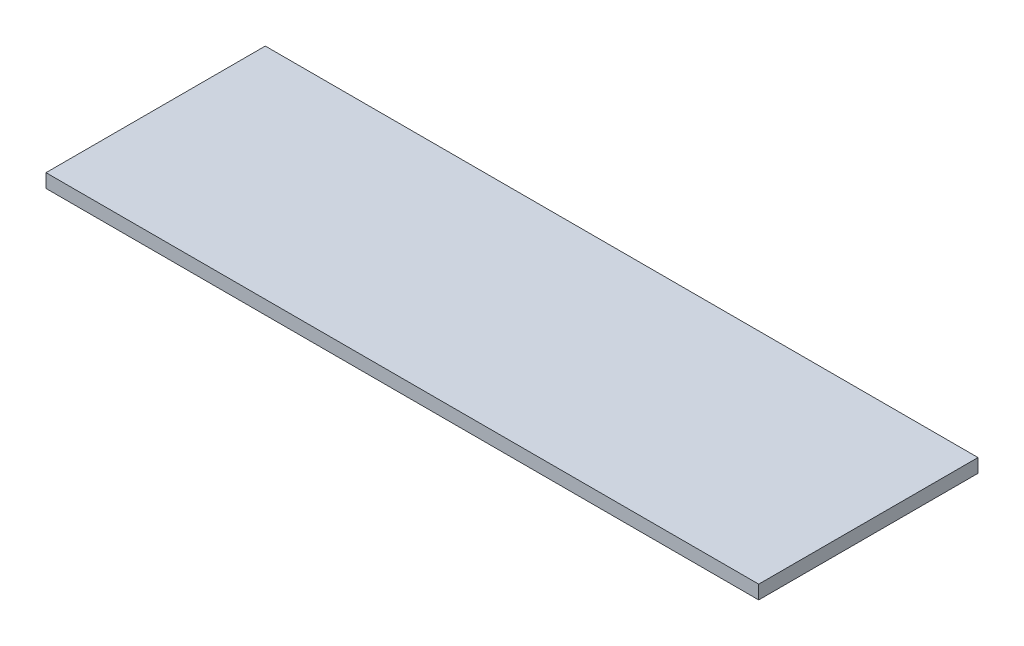
ISO-10303-21;
HEADER;
FILE_DESCRIPTION(('STEP AP214'),'2;1');
FILE_NAME('part.step','',(''),(''),'','','');
FILE_SCHEMA(('AUTOMOTIVE_DESIGN { 1 0 10303 214 1 1 1 1 }'));
ENDSEC;
DATA;
#1=APPLICATION_CONTEXT('core data for automotive mechanical design processes');
#2=APPLICATION_PROTOCOL_DEFINITION('international standard','automotive_design',2000,#1);
#3=PRODUCT_CONTEXT('',#1,'mechanical');
#4=PRODUCT('Part','Part','',(#3));
#5=PRODUCT_RELATED_PRODUCT_CATEGORY('part','',(#4));
#6=PRODUCT_DEFINITION_FORMATION('','',#4);
#7=PRODUCT_DEFINITION_CONTEXT('part definition',#1,'design');
#8=PRODUCT_DEFINITION('design','',#6,#7);
#9=PRODUCT_DEFINITION_SHAPE('','',#8);
#10=(LENGTH_UNIT() NAMED_UNIT(*) SI_UNIT(.MILLI.,.METRE.));
#11=(NAMED_UNIT(*) PLANE_ANGLE_UNIT() SI_UNIT($,.RADIAN.));
#12=(NAMED_UNIT(*) SI_UNIT($,.STERADIAN.) SOLID_ANGLE_UNIT());
#13=UNCERTAINTY_MEASURE_WITH_UNIT(LENGTH_MEASURE(1.E-05),#10,'distance_accuracy_value','');
#14=(GEOMETRIC_REPRESENTATION_CONTEXT(3) GLOBAL_UNCERTAINTY_ASSIGNED_CONTEXT((#13)) GLOBAL_UNIT_ASSIGNED_CONTEXT((#10,
#11,#12)) REPRESENTATION_CONTEXT('',''));
#15=CARTESIAN_POINT('',(0.,0.,0.));
#16=DIRECTION('',(0.,0.,1.));
#17=DIRECTION('',(1.,0.,0.));
#18=AXIS2_PLACEMENT_3D('',#15,#16,#17);
#19=CARTESIAN_POINT('',(-165.1,6.35,-50.8));
#20=DIRECTION('',(1.,0.,0.));
#21=DIRECTION('',(0.,0.,-1.));
#22=AXIS2_PLACEMENT_3D('',#19,#20,#21);
#23=PLANE('',#22);
#24=DIRECTION('',(0.,0.,1.));
#25=VECTOR('',#24,1.);
#26=CARTESIAN_POINT('',(-165.1,0.,-50.8));
#27=LINE('',#26,#25);
#28=CARTESIAN_POINT('',(-165.1,0.,-50.8));
#29=VERTEX_POINT('',#28);
#30=CARTESIAN_POINT('',(-165.1,0.,50.8));
#31=VERTEX_POINT('',#30);
#32=EDGE_CURVE('E107',#29,#31,#27,.T.);
#33=ORIENTED_EDGE('',*,*,#32,.T.);
#34=DIRECTION('',(0.,-1.,0.));
#35=VECTOR('',#34,1.);
#36=CARTESIAN_POINT('',(-165.1,6.35,50.8));
#37=LINE('',#36,#35);
#38=CARTESIAN_POINT('',(-165.1,6.35,50.8));
#39=VERTEX_POINT('',#38);
#40=EDGE_CURVE('E11',#39,#31,#37,.T.);
#41=ORIENTED_EDGE('',*,*,#40,.F.);
#42=DIRECTION('',(0.,0.,1.));
#43=VECTOR('',#42,1.);
#44=CARTESIAN_POINT('',(-165.1,6.35,-50.8));
#45=LINE('',#44,#43);
#46=CARTESIAN_POINT('',(-165.1,6.35,-50.8));
#47=VERTEX_POINT('',#46);
#48=EDGE_CURVE('E91',#47,#39,#45,.T.);
#49=ORIENTED_EDGE('',*,*,#48,.F.);
#50=DIRECTION('',(0.,-1.,0.));
#51=VECTOR('',#50,1.);
#52=CARTESIAN_POINT('',(-165.1,6.35,-50.8));
#53=LINE('',#52,#51);
#54=EDGE_CURVE('E103',#47,#29,#53,.T.);
#55=ORIENTED_EDGE('',*,*,#54,.T.);
#56=EDGE_LOOP('',(#33,#41,#49,#55));
#57=FACE_BOUND('',#56,.T.);
#58=ADVANCED_FACE('F39',(#57),#23,.F.);
#59=CARTESIAN_POINT('',(-165.1,6.35,50.8));
#60=DIRECTION('',(0.,0.,-1.));
#61=DIRECTION('',(-1.,0.,0.));
#62=AXIS2_PLACEMENT_3D('',#59,#60,#61);
#63=PLANE('',#62);
#64=DIRECTION('',(1.,0.,0.));
#65=VECTOR('',#64,1.);
#66=CARTESIAN_POINT('',(-165.1,0.,50.8));
#67=LINE('',#66,#65);
#68=CARTESIAN_POINT('',(165.1,0.,50.8));
#69=VERTEX_POINT('',#68);
#70=EDGE_CURVE('E96',#31,#69,#67,.T.);
#71=ORIENTED_EDGE('',*,*,#70,.T.);
#72=DIRECTION('',(0.,-1.,0.));
#73=VECTOR('',#72,1.);
#74=CARTESIAN_POINT('',(165.1,6.35,50.8));
#75=LINE('',#74,#73);
#76=CARTESIAN_POINT('',(165.1,6.35,50.8));
#77=VERTEX_POINT('',#76);
#78=EDGE_CURVE('E48',#77,#69,#75,.T.);
#79=ORIENTED_EDGE('',*,*,#78,.F.);
#80=DIRECTION('',(1.,0.,0.));
#81=VECTOR('',#80,1.);
#82=CARTESIAN_POINT('',(-165.1,6.35,50.8));
#83=LINE('',#82,#81);
#84=EDGE_CURVE('E86',#39,#77,#83,.T.);
#85=ORIENTED_EDGE('',*,*,#84,.F.);
#86=ORIENTED_EDGE('',*,*,#40,.T.);
#87=EDGE_LOOP('',(#71,#79,#85,#86));
#88=FACE_BOUND('',#87,.T.);
#89=ADVANCED_FACE('F95',(#88),#63,.F.);
#90=CARTESIAN_POINT('',(165.1,6.35,-50.8));
#91=DIRECTION('',(-1.,0.,0.));
#92=DIRECTION('',(0.,0.,1.));
#93=AXIS2_PLACEMENT_3D('',#90,#91,#92);
#94=PLANE('',#93);
#95=DIRECTION('',(0.,0.,-1.));
#96=VECTOR('',#95,1.);
#97=CARTESIAN_POINT('',(165.1,0.,-50.8));
#98=LINE('',#97,#96);
#99=CARTESIAN_POINT('',(165.1,0.,-50.8));
#100=VERTEX_POINT('',#99);
#101=EDGE_CURVE('E73',#69,#100,#98,.T.);
#102=ORIENTED_EDGE('',*,*,#101,.T.);
#103=DIRECTION('',(0.,-1.,0.));
#104=VECTOR('',#103,1.);
#105=CARTESIAN_POINT('',(165.1,6.35,-50.8));
#106=LINE('',#105,#104);
#107=CARTESIAN_POINT('',(165.1,6.35,-50.8));
#108=VERTEX_POINT('',#107);
#109=EDGE_CURVE('E98',#108,#100,#106,.T.);
#110=ORIENTED_EDGE('',*,*,#109,.F.);
#111=DIRECTION('',(0.,0.,-1.));
#112=VECTOR('',#111,1.);
#113=CARTESIAN_POINT('',(165.1,6.35,-50.8));
#114=LINE('',#113,#112);
#115=EDGE_CURVE('E89',#77,#108,#114,.T.);
#116=ORIENTED_EDGE('',*,*,#115,.F.);
#117=ORIENTED_EDGE('',*,*,#78,.T.);
#118=EDGE_LOOP('',(#102,#110,#116,#117));
#119=FACE_BOUND('',#118,.T.);
#120=ADVANCED_FACE('F99',(#119),#94,.F.);
#121=CARTESIAN_POINT('',(-165.1,6.35,-50.8));
#122=DIRECTION('',(0.,0.,1.));
#123=DIRECTION('',(1.,0.,0.));
#124=AXIS2_PLACEMENT_3D('',#121,#122,#123);
#125=PLANE('',#124);
#126=DIRECTION('',(-1.,0.,0.));
#127=VECTOR('',#126,1.);
#128=CARTESIAN_POINT('',(-165.1,0.,-50.8));
#129=LINE('',#128,#127);
#130=EDGE_CURVE('E79',#100,#29,#129,.T.);
#131=ORIENTED_EDGE('',*,*,#130,.T.);
#132=ORIENTED_EDGE('',*,*,#54,.F.);
#133=DIRECTION('',(-1.,0.,0.));
#134=VECTOR('',#133,1.);
#135=CARTESIAN_POINT('',(-165.1,6.35,-50.8));
#136=LINE('',#135,#134);
#137=EDGE_CURVE('E56',#108,#47,#136,.T.);
#138=ORIENTED_EDGE('',*,*,#137,.F.);
#139=ORIENTED_EDGE('',*,*,#109,.T.);
#140=EDGE_LOOP('',(#131,#132,#138,#139));
#141=FACE_BOUND('',#140,.T.);
#142=ADVANCED_FACE('F120',(#141),#125,.F.);
#143=CARTESIAN_POINT('',(0.,6.35,0.));
#144=DIRECTION('',(0.,1.,0.));
#145=DIRECTION('',(0.,0.,1.));
#146=AXIS2_PLACEMENT_3D('',#143,#144,#145);
#147=PLANE('',#146);
#148=ORIENTED_EDGE('',*,*,#48,.T.);
#149=ORIENTED_EDGE('',*,*,#84,.T.);
#150=ORIENTED_EDGE('',*,*,#115,.T.);
#151=ORIENTED_EDGE('',*,*,#137,.T.);
#152=EDGE_LOOP('',(#148,#149,#150,#151));
#153=FACE_BOUND('',#152,.T.);
#154=ADVANCED_FACE('F87',(#153),#147,.T.);
#155=CARTESIAN_POINT('',(0.,0.,0.));
#156=DIRECTION('',(0.,1.,0.));
#157=DIRECTION('',(0.,0.,1.));
#158=AXIS2_PLACEMENT_3D('',#155,#156,#157);
#159=PLANE('',#158);
#160=ORIENTED_EDGE('',*,*,#32,.F.);
#161=ORIENTED_EDGE('',*,*,#130,.F.);
#162=ORIENTED_EDGE('',*,*,#101,.F.);
#163=ORIENTED_EDGE('',*,*,#70,.F.);
#164=EDGE_LOOP('',(#160,#161,#162,#163));
#165=FACE_BOUND('',#164,.T.);
#166=ADVANCED_FACE('F123',(#165),#159,.F.);
#167=CLOSED_SHELL('',(#58,#89,#120,#142,#154,#166));
#168=MANIFOLD_SOLID_BREP('B2',#167);
#169=ADVANCED_BREP_SHAPE_REPRESENTATION('',(#18,#168),#14);
#170=SHAPE_DEFINITION_REPRESENTATION(#9,#169);
ENDSEC;
END-ISO-10303-21;
